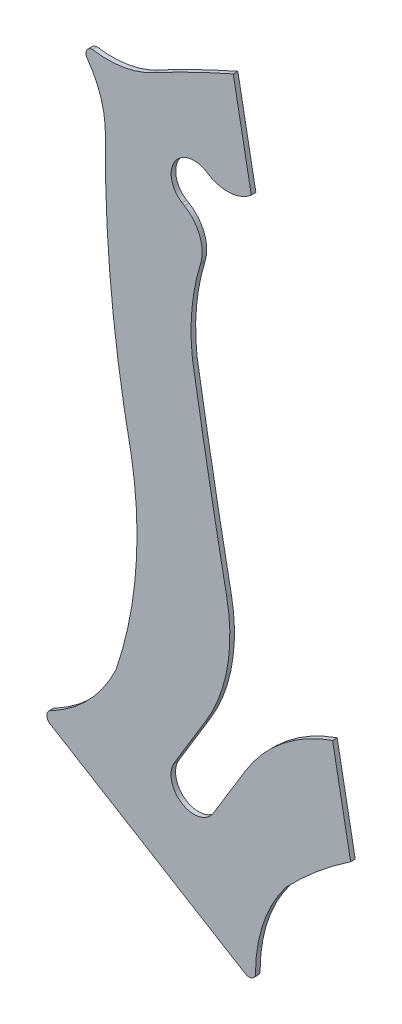
ISO-10303-21;
HEADER;
FILE_DESCRIPTION(('STEP AP214'),'2;1');
FILE_NAME('part.step','',(''),(''),'','','');
FILE_SCHEMA(('AUTOMOTIVE_DESIGN { 1 0 10303 214 1 1 1 1 }'));
ENDSEC;
DATA;
#1=APPLICATION_CONTEXT('core data for automotive mechanical design processes');
#2=APPLICATION_PROTOCOL_DEFINITION('international standard','automotive_design',2000,#1);
#3=PRODUCT_CONTEXT('',#1,'mechanical');
#4=PRODUCT('Part','Part','',(#3));
#5=PRODUCT_RELATED_PRODUCT_CATEGORY('part','',(#4));
#6=PRODUCT_DEFINITION_FORMATION('','',#4);
#7=PRODUCT_DEFINITION_CONTEXT('part definition',#1,'design');
#8=PRODUCT_DEFINITION('design','',#6,#7);
#9=PRODUCT_DEFINITION_SHAPE('','',#8);
#10=(LENGTH_UNIT() NAMED_UNIT(*) SI_UNIT(.MILLI.,.METRE.));
#11=(NAMED_UNIT(*) PLANE_ANGLE_UNIT() SI_UNIT($,.RADIAN.));
#12=(NAMED_UNIT(*) SI_UNIT($,.STERADIAN.) SOLID_ANGLE_UNIT());
#13=UNCERTAINTY_MEASURE_WITH_UNIT(LENGTH_MEASURE(1.E-05),#10,'distance_accuracy_value','');
#14=(GEOMETRIC_REPRESENTATION_CONTEXT(3) GLOBAL_UNCERTAINTY_ASSIGNED_CONTEXT((#13)) GLOBAL_UNIT_ASSIGNED_CONTEXT((#10,
#11,#12)) REPRESENTATION_CONTEXT('',''));
#15=CARTESIAN_POINT('',(0.,0.,0.));
#16=DIRECTION('',(0.,0.,1.));
#17=DIRECTION('',(1.,0.,0.));
#18=AXIS2_PLACEMENT_3D('',#15,#16,#17);
#19=CARTESIAN_POINT('',(-595.807272279208,616.910417452215,0.));
#20=DIRECTION('',(-0.982734564613668,-0.185021013708129,0.));
#21=DIRECTION('',(0.185021013708129,-0.982734564613668,0.));
#22=AXIS2_PLACEMENT_3D('',#19,#20,#21);
#23=PLANE('',#22);
#24=DIRECTION('',(0.185021013708129,-0.982734564613668,0.));
#25=VECTOR('',#24,1.);
#26=CARTESIAN_POINT('',(-168.673710483779,-1651.7989927399,0.));
#27=LINE('',#26,#25);
#28=CARTESIAN_POINT('',(-583.843519435553,553.365238413787,0.));
#29=VERTEX_POINT('',#28);
#30=CARTESIAN_POINT('',(-558.885959893304,420.803774615612,0.));
#31=VERTEX_POINT('',#30);
#32=EDGE_CURVE('E301',#29,#31,#27,.T.);
#33=ORIENTED_EDGE('',*,*,#32,.F.);
#34=DIRECTION('',(0.,0.,-1.));
#35=VECTOR('',#34,1.);
#36=CARTESIAN_POINT('',(-583.843519435553,553.365238413787,6.35));
#37=LINE('',#36,#35);
#38=CARTESIAN_POINT('',(-583.843519435553,553.365238413787,6.35));
#39=VERTEX_POINT('',#38);
#40=EDGE_CURVE('E302',#39,#29,#37,.T.);
#41=ORIENTED_EDGE('',*,*,#40,.F.);
#42=DIRECTION('',(0.185021013708129,-0.982734564613668,0.));
#43=VECTOR('',#42,1.);
#44=CARTESIAN_POINT('',(-168.673710483779,-1651.7989927399,6.35));
#45=LINE('',#44,#43);
#46=CARTESIAN_POINT('',(-558.885959893304,420.803774615612,6.35));
#47=VERTEX_POINT('',#46);
#48=EDGE_CURVE('E44',#39,#47,#45,.T.);
#49=ORIENTED_EDGE('',*,*,#48,.T.);
#50=DIRECTION('',(0.,0.,-1.));
#51=VECTOR('',#50,1.);
#52=CARTESIAN_POINT('',(-558.885959893304,420.803774615612,6.35));
#53=LINE('',#52,#51);
#54=EDGE_CURVE('E304',#31,#47,#53,.F.);
#55=ORIENTED_EDGE('',*,*,#54,.F.);
#56=EDGE_LOOP('',(#33,#41,#49,#55));
#57=FACE_BOUND('',#56,.T.);
#58=ADVANCED_FACE('F40',(#57),#23,.F.);
#59=CARTESIAN_POINT('',(-446.607072834725,-175.562773039793,6.35));
#60=VERTEX_POINT('',#59);
#61=CARTESIAN_POINT('',(-421.626142062902,-308.248372549149,6.35));
#62=VERTEX_POINT('',#61);
#63=EDGE_CURVE('E333',#60,#62,#45,.T.);
#64=ORIENTED_EDGE('',*,*,#63,.T.);
#65=DIRECTION('',(0.,0.,-1.));
#66=VECTOR('',#65,1.);
#67=CARTESIAN_POINT('',(-421.626142062902,-308.248372549149,6.35));
#68=LINE('',#67,#66);
#69=CARTESIAN_POINT('',(-421.626142062902,-308.248372549149,0.));
#70=VERTEX_POINT('',#69);
#71=EDGE_CURVE('E323',#62,#70,#68,.T.);
#72=ORIENTED_EDGE('',*,*,#71,.T.);
#73=CARTESIAN_POINT('',(-446.607072834725,-175.562773039793,0.));
#74=VERTEX_POINT('',#73);
#75=EDGE_CURVE('E296',#74,#70,#27,.T.);
#76=ORIENTED_EDGE('',*,*,#75,.F.);
#77=DIRECTION('',(0.,0.,-1.));
#78=VECTOR('',#77,1.);
#79=CARTESIAN_POINT('',(-446.607072834725,-175.562773039793,6.35));
#80=LINE('',#79,#78);
#81=EDGE_CURVE('E307',#60,#74,#80,.T.);
#82=ORIENTED_EDGE('',*,*,#81,.F.);
#83=EDGE_LOOP('',(#64,#72,#76,#82));
#84=FACE_BOUND('',#83,.T.);
#85=ADVANCED_FACE('F342',(#84),#23,.F.);
#86=CARTESIAN_POINT('',(-146.711440742145,-1647.66412096756,6.35));
#87=DIRECTION('',(0.,0.,1.));
#88=DIRECTION('',(1.,0.,0.));
#89=AXIS2_PLACEMENT_3D('',#86,#87,#88);
#90=PLANE('',#89);
#91=ORIENTED_EDGE('',*,*,#48,.F.);
#92=CARTESIAN_POINT('',(101.313713674877,-998.248317486922,6.35));
#93=DIRECTION('',(0.,0.,1.));
#94=DIRECTION('',(1.,0.,0.));
#95=AXIS2_PLACEMENT_3D('',#92,#93,#94);
#96=CIRCLE('',#95,1696.15596598261);
#97=CARTESIAN_POINT('',(-692.86211101161,500.494429091663,6.35));
#98=VERTEX_POINT('',#97);
#99=EDGE_CURVE('E139',#39,#98,#96,.T.);
#100=ORIENTED_EDGE('',*,*,#99,.T.);
#101=CARTESIAN_POINT('',(-757.496180180853,616.263088196707,6.35));
#102=DIRECTION('',(0.,0.,1.));
#103=DIRECTION('',(1.,0.,0.));
#104=AXIS2_PLACEMENT_3D('',#101,#102,#103);
#105=CIRCLE('',#104,132.589386182886);
#106=CARTESIAN_POINT('',(-778.634361676283,485.369533689922,6.35));
#107=VERTEX_POINT('',#106);
#108=EDGE_CURVE('E294',#107,#98,#105,.T.);
#109=ORIENTED_EDGE('',*,*,#108,.F.);
#110=CARTESIAN_POINT('',(-778.131598857839,476.167307801734,6.35));
#111=DIRECTION('',(0.,0.,1.));
#112=DIRECTION('',(1.,0.,0.));
#113=AXIS2_PLACEMENT_3D('',#110,#111,#112);
#114=CIRCLE('',#113,9.21594985602913);
#115=CARTESIAN_POINT('',(-786.532760791132,472.378612786392,6.35));
#116=VERTEX_POINT('',#115);
#117=EDGE_CURVE('E292',#107,#116,#114,.T.);
#118=ORIENTED_EDGE('',*,*,#117,.T.);
#119=CARTESIAN_POINT('',(-893.012468796338,393.372175634305,6.35));
#120=DIRECTION('',(0.,0.,1.));
#121=DIRECTION('',(1.,0.,0.));
#122=AXIS2_PLACEMENT_3D('',#119,#120,#121);
#123=CIRCLE('',#122,132.589386182834);
#124=CARTESIAN_POINT('',(-760.486593002621,389.268814396994,6.35));
#125=VERTEX_POINT('',#124);
#126=EDGE_CURVE('E216',#125,#116,#123,.T.);
#127=ORIENTED_EDGE('',*,*,#126,.F.);
#128=CARTESIAN_POINT('',(935.600172176311,373.947393991518,6.35));
#129=DIRECTION('',(0.,0.,1.));
#130=DIRECTION('',(1.,0.,0.));
#131=AXIS2_PLACEMENT_3D('',#128,#129,#130);
#132=CIRCLE('',#131,1696.1559659826);
#133=CARTESIAN_POINT('',(-724.729968779218,27.1781854781785,6.35));
#134=VERTEX_POINT('',#133);
#135=EDGE_CURVE('E288',#125,#134,#132,.T.);
#136=ORIENTED_EDGE('',*,*,#135,.T.);
#137=CARTESIAN_POINT('',(-1260.05593605962,-65.354714697655,6.35));
#138=DIRECTION('',(0.,0.,1.));
#139=DIRECTION('',(1.,0.,0.));
#140=AXIS2_PLACEMENT_3D('',#137,#138,#139);
#141=CIRCLE('',#140,543.264418915569);
#142=CARTESIAN_POINT('',(-745.623103348854,-239.983147344954,6.35));
#143=VERTEX_POINT('',#142);
#144=EDGE_CURVE('E285',#143,#134,#141,.T.);
#145=ORIENTED_EDGE('',*,*,#144,.F.);
#146=CARTESIAN_POINT('',(-929.332484300062,-155.12426119461,6.35));
#147=DIRECTION('',(0.,0.,1.));
#148=DIRECTION('',(1.,0.,0.));
#149=AXIS2_PLACEMENT_3D('',#146,#147,#148);
#150=CIRCLE('',#149,202.361476591157);
#151=CARTESIAN_POINT('',(-834.966129535259,-334.135876171256,6.35));
#152=VERTEX_POINT('',#151);
#153=EDGE_CURVE('E282',#152,#143,#150,.T.);
#154=ORIENTED_EDGE('',*,*,#153,.F.);
#155=CARTESIAN_POINT('',(-832.307098275944,-342.959893652528,6.35));
#156=DIRECTION('',(0.,0.,1.));
#157=DIRECTION('',(1.,0.,0.));
#158=AXIS2_PLACEMENT_3D('',#155,#156,#157);
#159=CIRCLE('',#158,9.21594985597405);
#160=CARTESIAN_POINT('',(-837.094869811113,-350.83459843905,6.35));
#161=VERTEX_POINT('',#160);
#162=EDGE_CURVE('E280',#152,#161,#159,.T.);
#163=ORIENTED_EDGE('',*,*,#162,.T.);
#164=DIRECTION('',(-0.854464803909369,0.519509286615863,0.));
#165=VECTOR('',#164,1.);
#166=CARTESIAN_POINT('',(242.626783769419,-1007.2986487182,6.35));
#167=LINE('',#166,#165);
#168=CARTESIAN_POINT('',(-566.864895068179,-515.132742445253,6.35));
#169=VERTEX_POINT('',#168);
#170=EDGE_CURVE('E277',#169,#161,#167,.T.);
#171=ORIENTED_EDGE('',*,*,#170,.F.);
#172=CARTESIAN_POINT('',(-562.077123533031,-507.258037658723,6.35));
#173=DIRECTION('',(0.,0.,1.));
#174=DIRECTION('',(1.,0.,0.));
#175=AXIS2_PLACEMENT_3D('',#172,#173,#174);
#176=CIRCLE('',#175,9.21594985597236);
#177=CARTESIAN_POINT('',(-553.019378541291,-505.55774726811,6.35));
#178=VERTEX_POINT('',#177);
#179=EDGE_CURVE('E274',#169,#178,#176,.T.);
#180=ORIENTED_EDGE('',*,*,#179,.T.);
#181=CARTESIAN_POINT('',(-350.662704377986,-506.951888474319,6.35));
#182=DIRECTION('',(0.,0.,1.));
#183=DIRECTION('',(1.,0.,0.));
#184=AXIS2_PLACEMENT_3D('',#181,#182,#183);
#185=CIRCLE('',#184,202.361476591148);
#186=CARTESIAN_POINT('',(-510.547599401306,-382.907591743143,6.35));
#187=VERTEX_POINT('',#186);
#188=EDGE_CURVE('E271',#187,#178,#185,.T.);
#189=ORIENTED_EDGE('',*,*,#188,.F.);
#190=CARTESIAN_POINT('',(-118.759256121082,-759.25599804977,6.35));
#191=DIRECTION('',(0.,0.,1.));
#192=DIRECTION('',(1.,0.,0.));
#193=AXIS2_PLACEMENT_3D('',#190,#191,#192);
#194=CIRCLE('',#193,543.264418915691);
#195=EDGE_CURVE('E275',#62,#187,#194,.T.);
#196=ORIENTED_EDGE('',*,*,#195,.F.);
#197=ORIENTED_EDGE('',*,*,#63,.F.);
#198=CARTESIAN_POINT('',(-372.193427367632,-391.712187492445,6.35));
#199=DIRECTION('',(0.,0.,1.));
#200=DIRECTION('',(1.,0.,0.));
#201=AXIS2_PLACEMENT_3D('',#198,#199,#200);
#202=CIRCLE('',#201,228.599999999839);
#203=CARTESIAN_POINT('',(-567.524081541108,-272.952364571719,6.35));
#204=VERTEX_POINT('',#203);
#205=EDGE_CURVE('E270',#60,#204,#202,.T.);
#206=ORIENTED_EDGE('',*,*,#205,.T.);
#207=DIRECTION('',(0.519509286616884,0.854464803908749,0.));
#208=VECTOR('',#207,1.);
#209=CARTESIAN_POINT('',(-1064.18884942714,-1089.84356254003,6.35));
#210=LINE('',#209,#208);
#211=CARTESIAN_POINT('',(-611.01367111314,-344.482026471955,6.35));
#212=VERTEX_POINT('',#211);
#213=EDGE_CURVE('E267',#212,#204,#210,.T.);
#214=ORIENTED_EDGE('',*,*,#213,.F.);
#215=CARTESIAN_POINT('',(-638.142928637472,-327.987606621774,6.35));
#216=DIRECTION('',(0.,0.,1.));
#217=DIRECTION('',(1.,0.,0.));
#218=AXIS2_PLACEMENT_3D('',#215,#216,#217);
#219=CIRCLE('',#218,31.7500000002435);
#220=CARTESIAN_POINT('',(-665.272186161801,-311.493186771594,6.35));
#221=VERTEX_POINT('',#220);
#222=EDGE_CURVE('E264',#221,#212,#219,.T.);
#223=ORIENTED_EDGE('',*,*,#222,.F.);
#224=DIRECTION('',(0.519509286616441,0.854464803909018,0.));
#225=VECTOR('',#224,1.);
#226=CARTESIAN_POINT('',(-1118.44736447569,-1056.85472284034,6.35));
#227=LINE('',#226,#225);
#228=CARTESIAN_POINT('',(-621.782596590261,-239.963524872085,6.35));
#229=VERTEX_POINT('',#228);
#230=EDGE_CURVE('E261',#221,#229,#227,.T.);
#231=ORIENTED_EDGE('',*,*,#230,.T.);
#232=CARTESIAN_POINT('',(-817.113250763849,-121.203701951544,6.35));
#233=DIRECTION('',(0.,0.,1.));
#234=DIRECTION('',(1.,0.,0.));
#235=AXIS2_PLACEMENT_3D('',#232,#233,#234);
#236=CIRCLE('',#235,228.599999999843);
#237=CARTESIAN_POINT('',(-592.845089449618,-76.9120343305014,6.35));
#238=VERTEX_POINT('',#237);
#239=EDGE_CURVE('E259',#229,#238,#236,.T.);
#240=ORIENTED_EDGE('',*,*,#239,.T.);
#241=CARTESIAN_POINT('',(7879.01936580354,1596.23230427157,6.35));
#242=DIRECTION('',(0.,0.,1.));
#243=DIRECTION('',(1.,0.,0.));
#244=AXIS2_PLACEMENT_3D('',#241,#242,#243);
#245=CIRCLE('',#244,8635.50226251942);
#246=CARTESIAN_POINT('',(-640.198587445303,183.849639757226,6.35));
#247=VERTEX_POINT('',#246);
#248=EDGE_CURVE('E256',#247,#238,#245,.T.);
#249=ORIENTED_EDGE('',*,*,#248,.F.);
#250=CARTESIAN_POINT('',(-353.119452704755,217.37129382989,6.35));
#251=DIRECTION('',(0.,0.,1.));
#252=DIRECTION('',(1.,0.,0.));
#253=AXIS2_PLACEMENT_3D('',#250,#251,#252);
#254=CIRCLE('',#253,289.029636707155);
#255=CARTESIAN_POINT('',(-629.075505090477,303.31539221226,6.35));
#256=VERTEX_POINT('',#255);
#257=EDGE_CURVE('E253',#256,#247,#254,.T.);
#258=ORIENTED_EDGE('',*,*,#257,.F.);
#259=CARTESIAN_POINT('',(-677.577685073191,318.420971858689,6.35));
#260=DIRECTION('',(0.,0.,1.));
#261=DIRECTION('',(1.,0.,0.));
#262=AXIS2_PLACEMENT_3D('',#259,#260,#261);
#263=CIRCLE('',#262,50.7999999953769);
#264=CARTESIAN_POINT('',(-651.186613315133,361.827783893108,6.35));
#265=VERTEX_POINT('',#264);
#266=EDGE_CURVE('E249',#256,#265,#263,.T.);
#267=ORIENTED_EDGE('',*,*,#266,.T.);
#268=DIRECTION('',(-0.854464803906054,0.519509286621317,0.));
#269=VECTOR('',#268,1.);
#270=CARTESIAN_POINT('',(609.154086737313,-404.451523330465,6.35));
#271=LINE('',#270,#269);
#272=CARTESIAN_POINT('',(-654.429109389422,363.799201340294,6.35));
#273=VERTEX_POINT('',#272);
#274=EDGE_CURVE('E246',#265,#273,#271,.T.);
#275=ORIENTED_EDGE('',*,*,#274,.T.);
#276=CARTESIAN_POINT('',(-637.934689539119,390.928458864549,6.35));
#277=DIRECTION('',(0.,0.,1.));
#278=DIRECTION('',(1.,0.,0.));
#279=AXIS2_PLACEMENT_3D('',#276,#277,#278);
#280=CIRCLE('',#279,31.7500000002435);
#281=CARTESIAN_POINT('',(-621.440269688581,418.057716388663,6.35));
#282=VERTEX_POINT('',#281);
#283=EDGE_CURVE('E241',#282,#273,#280,.T.);
#284=ORIENTED_EDGE('',*,*,#283,.F.);
#285=DIRECTION('',(-0.854464803904012,0.519509286624676,0.));
#286=VECTOR('',#285,1.);
#287=CARTESIAN_POINT('',(642.142926440099,-350.193008290082,6.35));
#288=LINE('',#287,#286);
#289=CARTESIAN_POINT('',(-618.197773615554,416.086298942227,6.35));
#290=VERTEX_POINT('',#289);
#291=EDGE_CURVE('E238',#290,#282,#288,.T.);
#292=ORIENTED_EDGE('',*,*,#291,.F.);
#293=CARTESIAN_POINT('',(-591.806701857498,459.493110976643,6.35));
#294=DIRECTION('',(0.,0.,1.));
#295=DIRECTION('',(1.,0.,0.));
#296=AXIS2_PLACEMENT_3D('',#293,#294,#295);
#297=CIRCLE('',#296,50.7999999953742);
#298=EDGE_CURVE('E242',#290,#47,#297,.T.);
#299=ORIENTED_EDGE('',*,*,#298,.T.);
#300=EDGE_LOOP('',(#91,#100,#109,#118,#127,#136,#145,#154,#163,#171,#180,#189,#196,#197,#206,
#214,#223,#231,#240,#249,#258,#267,#275,#284,#292,#299));
#301=FACE_BOUND('',#300,.T.);
#302=ADVANCED_FACE('F42',(#301),#90,.T.);
#303=CARTESIAN_POINT('',(-146.711440742145,-1647.66412096756,0.));
#304=DIRECTION('',(0.,0.,1.));
#305=DIRECTION('',(1.,0.,0.));
#306=AXIS2_PLACEMENT_3D('',#303,#304,#305);
#307=PLANE('',#306);
#308=CARTESIAN_POINT('',(101.313713674877,-998.248317486922,0.));
#309=DIRECTION('',(0.,0.,1.));
#310=DIRECTION('',(1.,0.,0.));
#311=AXIS2_PLACEMENT_3D('',#308,#309,#310);
#312=CIRCLE('',#311,1696.15596598261);
#313=CARTESIAN_POINT('',(-692.86211101161,500.494429091663,0.));
#314=VERTEX_POINT('',#313);
#315=EDGE_CURVE('E11',#29,#314,#312,.T.);
#316=ORIENTED_EDGE('',*,*,#315,.F.);
#317=ORIENTED_EDGE('',*,*,#32,.T.);
#318=CARTESIAN_POINT('',(-591.806701857498,459.493110976643,0.));
#319=DIRECTION('',(0.,0.,1.));
#320=DIRECTION('',(1.,0.,0.));
#321=AXIS2_PLACEMENT_3D('',#318,#319,#320);
#322=CIRCLE('',#321,50.7999999953742);
#323=CARTESIAN_POINT('',(-618.197773615554,416.086298942227,0.));
#324=VERTEX_POINT('',#323);
#325=EDGE_CURVE('E312',#324,#31,#322,.T.);
#326=ORIENTED_EDGE('',*,*,#325,.F.);
#327=DIRECTION('',(-0.854464803904012,0.519509286624676,0.));
#328=VECTOR('',#327,1.);
#329=CARTESIAN_POINT('',(642.142926440099,-350.193008290082,0.));
#330=LINE('',#329,#328);
#331=CARTESIAN_POINT('',(-621.440269688581,418.057716388663,0.));
#332=VERTEX_POINT('',#331);
#333=EDGE_CURVE('E314',#324,#332,#330,.T.);
#334=ORIENTED_EDGE('',*,*,#333,.T.);
#335=CARTESIAN_POINT('',(-637.934689539119,390.928458864549,0.));
#336=DIRECTION('',(0.,0.,1.));
#337=DIRECTION('',(1.,0.,0.));
#338=AXIS2_PLACEMENT_3D('',#335,#336,#337);
#339=CIRCLE('',#338,31.7500000002435);
#340=CARTESIAN_POINT('',(-654.429109389422,363.799201340294,0.));
#341=VERTEX_POINT('',#340);
#342=EDGE_CURVE('E390',#332,#341,#339,.T.);
#343=ORIENTED_EDGE('',*,*,#342,.T.);
#344=DIRECTION('',(-0.854464803906054,0.519509286621317,0.));
#345=VECTOR('',#344,1.);
#346=CARTESIAN_POINT('',(609.154086737313,-404.451523330465,0.));
#347=LINE('',#346,#345);
#348=CARTESIAN_POINT('',(-651.186613315133,361.827783893108,0.));
#349=VERTEX_POINT('',#348);
#350=EDGE_CURVE('E394',#349,#341,#347,.T.);
#351=ORIENTED_EDGE('',*,*,#350,.F.);
#352=CARTESIAN_POINT('',(-677.577685073191,318.420971858689,0.));
#353=DIRECTION('',(0.,0.,1.));
#354=DIRECTION('',(1.,0.,0.));
#355=AXIS2_PLACEMENT_3D('',#352,#353,#354);
#356=CIRCLE('',#355,50.7999999953769);
#357=CARTESIAN_POINT('',(-629.075505090477,303.31539221226,0.));
#358=VERTEX_POINT('',#357);
#359=EDGE_CURVE('E398',#358,#349,#356,.T.);
#360=ORIENTED_EDGE('',*,*,#359,.F.);
#361=CARTESIAN_POINT('',(-353.119452704755,217.37129382989,0.));
#362=DIRECTION('',(0.,0.,1.));
#363=DIRECTION('',(1.,0.,0.));
#364=AXIS2_PLACEMENT_3D('',#361,#362,#363);
#365=CIRCLE('',#364,289.029636707155);
#366=CARTESIAN_POINT('',(-640.198587445303,183.849639757226,0.));
#367=VERTEX_POINT('',#366);
#368=EDGE_CURVE('E402',#358,#367,#365,.T.);
#369=ORIENTED_EDGE('',*,*,#368,.T.);
#370=CARTESIAN_POINT('',(7879.01936580354,1596.23230427157,0.));
#371=DIRECTION('',(0.,0.,1.));
#372=DIRECTION('',(1.,0.,0.));
#373=AXIS2_PLACEMENT_3D('',#370,#371,#372);
#374=CIRCLE('',#373,8635.50226251942);
#375=CARTESIAN_POINT('',(-592.845089449618,-76.9120343305014,0.));
#376=VERTEX_POINT('',#375);
#377=EDGE_CURVE('E405',#367,#376,#374,.T.);
#378=ORIENTED_EDGE('',*,*,#377,.T.);
#379=CARTESIAN_POINT('',(-817.113250763849,-121.203701951544,0.));
#380=DIRECTION('',(0.,0.,1.));
#381=DIRECTION('',(1.,0.,0.));
#382=AXIS2_PLACEMENT_3D('',#379,#380,#381);
#383=CIRCLE('',#382,228.599999999843);
#384=CARTESIAN_POINT('',(-621.782596590261,-239.963524872085,0.));
#385=VERTEX_POINT('',#384);
#386=EDGE_CURVE('E408',#385,#376,#383,.T.);
#387=ORIENTED_EDGE('',*,*,#386,.F.);
#388=DIRECTION('',(0.519509286616441,0.854464803909018,0.));
#389=VECTOR('',#388,1.);
#390=CARTESIAN_POINT('',(-1118.44736447569,-1056.85472284034,0.));
#391=LINE('',#390,#389);
#392=CARTESIAN_POINT('',(-665.272186161801,-311.493186771594,0.));
#393=VERTEX_POINT('',#392);
#394=EDGE_CURVE('E411',#393,#385,#391,.T.);
#395=ORIENTED_EDGE('',*,*,#394,.F.);
#396=CARTESIAN_POINT('',(-638.142928637472,-327.987606621774,0.));
#397=DIRECTION('',(0.,0.,1.));
#398=DIRECTION('',(1.,0.,0.));
#399=AXIS2_PLACEMENT_3D('',#396,#397,#398);
#400=CIRCLE('',#399,31.7500000002435);
#401=CARTESIAN_POINT('',(-611.01367111314,-344.482026471955,0.));
#402=VERTEX_POINT('',#401);
#403=EDGE_CURVE('E414',#393,#402,#400,.T.);
#404=ORIENTED_EDGE('',*,*,#403,.T.);
#405=DIRECTION('',(0.519509286616884,0.854464803908749,0.));
#406=VECTOR('',#405,1.);
#407=CARTESIAN_POINT('',(-1064.18884942714,-1089.84356254003,0.));
#408=LINE('',#407,#406);
#409=CARTESIAN_POINT('',(-567.524081541108,-272.952364571719,0.));
#410=VERTEX_POINT('',#409);
#411=EDGE_CURVE('E321',#402,#410,#408,.T.);
#412=ORIENTED_EDGE('',*,*,#411,.T.);
#413=CARTESIAN_POINT('',(-372.193427367632,-391.712187492445,0.));
#414=DIRECTION('',(0.,0.,1.));
#415=DIRECTION('',(1.,0.,0.));
#416=AXIS2_PLACEMENT_3D('',#413,#414,#415);
#417=CIRCLE('',#416,228.599999999839);
#418=EDGE_CURVE('E319',#74,#410,#417,.T.);
#419=ORIENTED_EDGE('',*,*,#418,.F.);
#420=ORIENTED_EDGE('',*,*,#75,.T.);
#421=CARTESIAN_POINT('',(-118.759256121082,-759.25599804977,0.));
#422=DIRECTION('',(0.,0.,1.));
#423=DIRECTION('',(1.,0.,0.));
#424=AXIS2_PLACEMENT_3D('',#421,#422,#423);
#425=CIRCLE('',#424,543.264418915691);
#426=CARTESIAN_POINT('',(-510.547599401306,-382.907591743143,0.));
#427=VERTEX_POINT('',#426);
#428=EDGE_CURVE('E316',#70,#427,#425,.T.);
#429=ORIENTED_EDGE('',*,*,#428,.T.);
#430=CARTESIAN_POINT('',(-350.662704377986,-506.951888474319,0.));
#431=DIRECTION('',(0.,0.,1.));
#432=DIRECTION('',(1.,0.,0.));
#433=AXIS2_PLACEMENT_3D('',#430,#431,#432);
#434=CIRCLE('',#433,202.361476591148);
#435=CARTESIAN_POINT('',(-553.019378541291,-505.55774726811,0.));
#436=VERTEX_POINT('',#435);
#437=EDGE_CURVE('E318',#427,#436,#434,.T.);
#438=ORIENTED_EDGE('',*,*,#437,.T.);
#439=CARTESIAN_POINT('',(-562.077123533031,-507.258037658723,0.));
#440=DIRECTION('',(0.,0.,1.));
#441=DIRECTION('',(1.,0.,0.));
#442=AXIS2_PLACEMENT_3D('',#439,#440,#441);
#443=CIRCLE('',#442,9.21594985597236);
#444=CARTESIAN_POINT('',(-566.864895068179,-515.132742445253,0.));
#445=VERTEX_POINT('',#444);
#446=EDGE_CURVE('E420',#445,#436,#443,.T.);
#447=ORIENTED_EDGE('',*,*,#446,.F.);
#448=DIRECTION('',(-0.854464803909369,0.519509286615863,0.));
#449=VECTOR('',#448,1.);
#450=CARTESIAN_POINT('',(242.626783769419,-1007.2986487182,0.));
#451=LINE('',#450,#449);
#452=CARTESIAN_POINT('',(-837.094869811113,-350.83459843905,0.));
#453=VERTEX_POINT('',#452);
#454=EDGE_CURVE('E423',#445,#453,#451,.T.);
#455=ORIENTED_EDGE('',*,*,#454,.T.);
#456=CARTESIAN_POINT('',(-832.307098275944,-342.959893652528,0.));
#457=DIRECTION('',(0.,0.,1.));
#458=DIRECTION('',(1.,0.,0.));
#459=AXIS2_PLACEMENT_3D('',#456,#457,#458);
#460=CIRCLE('',#459,9.21594985597405);
#461=CARTESIAN_POINT('',(-834.966129535259,-334.135876171256,0.));
#462=VERTEX_POINT('',#461);
#463=EDGE_CURVE('E426',#462,#453,#460,.T.);
#464=ORIENTED_EDGE('',*,*,#463,.F.);
#465=CARTESIAN_POINT('',(-929.332484300062,-155.12426119461,0.));
#466=DIRECTION('',(0.,0.,1.));
#467=DIRECTION('',(1.,0.,0.));
#468=AXIS2_PLACEMENT_3D('',#465,#466,#467);
#469=CIRCLE('',#468,202.361476591157);
#470=CARTESIAN_POINT('',(-745.623103348854,-239.983147344954,0.));
#471=VERTEX_POINT('',#470);
#472=EDGE_CURVE('E429',#462,#471,#469,.T.);
#473=ORIENTED_EDGE('',*,*,#472,.T.);
#474=CARTESIAN_POINT('',(-1260.05593605962,-65.354714697655,0.));
#475=DIRECTION('',(0.,0.,1.));
#476=DIRECTION('',(1.,0.,0.));
#477=AXIS2_PLACEMENT_3D('',#474,#475,#476);
#478=CIRCLE('',#477,543.264418915569);
#479=CARTESIAN_POINT('',(-724.729968779218,27.1781854781785,0.));
#480=VERTEX_POINT('',#479);
#481=EDGE_CURVE('E233',#471,#480,#478,.T.);
#482=ORIENTED_EDGE('',*,*,#481,.T.);
#483=CARTESIAN_POINT('',(935.600172176311,373.947393991518,0.));
#484=DIRECTION('',(0.,0.,1.));
#485=DIRECTION('',(1.,0.,0.));
#486=AXIS2_PLACEMENT_3D('',#483,#484,#485);
#487=CIRCLE('',#486,1696.1559659826);
#488=CARTESIAN_POINT('',(-760.486593002621,389.268814396994,0.));
#489=VERTEX_POINT('',#488);
#490=EDGE_CURVE('E230',#489,#480,#487,.T.);
#491=ORIENTED_EDGE('',*,*,#490,.F.);
#492=CARTESIAN_POINT('',(-893.012468796338,393.372175634305,0.));
#493=DIRECTION('',(0.,0.,1.));
#494=DIRECTION('',(1.,0.,0.));
#495=AXIS2_PLACEMENT_3D('',#492,#493,#494);
#496=CIRCLE('',#495,132.589386182834);
#497=CARTESIAN_POINT('',(-786.532760791132,472.378612786392,0.));
#498=VERTEX_POINT('',#497);
#499=EDGE_CURVE('E214',#489,#498,#496,.T.);
#500=ORIENTED_EDGE('',*,*,#499,.T.);
#501=CARTESIAN_POINT('',(-778.131598857839,476.167307801734,0.));
#502=DIRECTION('',(0.,0.,1.));
#503=DIRECTION('',(1.,0.,0.));
#504=AXIS2_PLACEMENT_3D('',#501,#502,#503);
#505=CIRCLE('',#504,9.21594985602913);
#506=CARTESIAN_POINT('',(-778.634361676283,485.369533689922,0.));
#507=VERTEX_POINT('',#506);
#508=EDGE_CURVE('E221',#507,#498,#505,.T.);
#509=ORIENTED_EDGE('',*,*,#508,.F.);
#510=CARTESIAN_POINT('',(-757.496180180853,616.263088196707,0.));
#511=DIRECTION('',(0.,0.,1.));
#512=DIRECTION('',(1.,0.,0.));
#513=AXIS2_PLACEMENT_3D('',#510,#511,#512);
#514=CIRCLE('',#513,132.589386182886);
#515=EDGE_CURVE('E50',#507,#314,#514,.T.);
#516=ORIENTED_EDGE('',*,*,#515,.T.);
#517=EDGE_LOOP('',(#316,#317,#326,#334,#343,#351,#360,#369,#378,#387,#395,#404,#412,#419,#420,
#429,#438,#447,#455,#464,#473,#482,#491,#500,#509,#516));
#518=FACE_BOUND('',#517,.T.);
#519=ADVANCED_FACE('F227',(#518),#307,.F.);
#520=CARTESIAN_POINT('',(-372.193427367632,-391.712187492445,6.35));
#521=DIRECTION('',(0.,0.,-1.));
#522=DIRECTION('',(-1.,0.,0.));
#523=AXIS2_PLACEMENT_3D('',#520,#521,#522);
#524=CYLINDRICAL_SURFACE('',#523,228.599999999839);
#525=ORIENTED_EDGE('',*,*,#205,.F.);
#526=ORIENTED_EDGE('',*,*,#81,.T.);
#527=ORIENTED_EDGE('',*,*,#418,.T.);
#528=DIRECTION('',(0.,0.,-1.));
#529=VECTOR('',#528,1.);
#530=CARTESIAN_POINT('',(-567.524081541108,-272.952364571719,6.35));
#531=LINE('',#530,#529);
#532=EDGE_CURVE('E300',#204,#410,#531,.T.);
#533=ORIENTED_EDGE('',*,*,#532,.F.);
#534=EDGE_LOOP('',(#525,#526,#527,#533));
#535=FACE_BOUND('',#534,.T.);
#536=ADVANCED_FACE('F535',(#535),#524,.T.);
#537=CARTESIAN_POINT('',(-1064.18884942714,-1089.84356254003,6.35));
#538=DIRECTION('',(-0.854464803908749,0.519509286616884,0.));
#539=DIRECTION('',(-0.519509286616884,-0.854464803908749,0.));
#540=AXIS2_PLACEMENT_3D('',#537,#538,#539);
#541=PLANE('',#540);
#542=ORIENTED_EDGE('',*,*,#411,.F.);
#543=DIRECTION('',(0.,0.,-1.));
#544=VECTOR('',#543,1.);
#545=CARTESIAN_POINT('',(-611.01367111314,-344.482026471955,6.35));
#546=LINE('',#545,#544);
#547=EDGE_CURVE('E364',#212,#402,#546,.T.);
#548=ORIENTED_EDGE('',*,*,#547,.F.);
#549=ORIENTED_EDGE('',*,*,#213,.T.);
#550=ORIENTED_EDGE('',*,*,#532,.T.);
#551=EDGE_LOOP('',(#542,#548,#549,#550));
#552=FACE_BOUND('',#551,.T.);
#553=ADVANCED_FACE('F531',(#552),#541,.T.);
#554=CARTESIAN_POINT('',(-638.142928637472,-327.987606621774,6.35));
#555=DIRECTION('',(0.,0.,-1.));
#556=DIRECTION('',(-1.,0.,0.));
#557=AXIS2_PLACEMENT_3D('',#554,#555,#556);
#558=CYLINDRICAL_SURFACE('',#557,31.7500000002435);
#559=ORIENTED_EDGE('',*,*,#403,.F.);
#560=DIRECTION('',(0.,0.,-1.));
#561=VECTOR('',#560,1.);
#562=CARTESIAN_POINT('',(-665.272186161801,-311.493186771594,6.35));
#563=LINE('',#562,#561);
#564=EDGE_CURVE('E366',#221,#393,#563,.T.);
#565=ORIENTED_EDGE('',*,*,#564,.F.);
#566=ORIENTED_EDGE('',*,*,#222,.T.);
#567=ORIENTED_EDGE('',*,*,#547,.T.);
#568=EDGE_LOOP('',(#559,#565,#566,#567));
#569=FACE_BOUND('',#568,.T.);
#570=ADVANCED_FACE('F527',(#569),#558,.F.);
#571=CARTESIAN_POINT('',(-1118.44736447569,-1056.85472284034,6.35));
#572=DIRECTION('',(-0.854464803909018,0.519509286616441,0.));
#573=DIRECTION('',(-0.519509286616441,-0.854464803909018,0.));
#574=AXIS2_PLACEMENT_3D('',#571,#572,#573);
#575=PLANE('',#574);
#576=ORIENTED_EDGE('',*,*,#394,.T.);
#577=DIRECTION('',(0.,0.,-1.));
#578=VECTOR('',#577,1.);
#579=CARTESIAN_POINT('',(-621.782596590261,-239.963524872085,6.35));
#580=LINE('',#579,#578);
#581=EDGE_CURVE('E368',#229,#385,#580,.T.);
#582=ORIENTED_EDGE('',*,*,#581,.F.);
#583=ORIENTED_EDGE('',*,*,#230,.F.);
#584=ORIENTED_EDGE('',*,*,#564,.T.);
#585=EDGE_LOOP('',(#576,#582,#583,#584));
#586=FACE_BOUND('',#585,.T.);
#587=ADVANCED_FACE('F523',(#586),#575,.F.);
#588=CARTESIAN_POINT('',(-817.113250763849,-121.203701951544,6.35));
#589=DIRECTION('',(0.,0.,-1.));
#590=DIRECTION('',(-1.,0.,0.));
#591=AXIS2_PLACEMENT_3D('',#588,#589,#590);
#592=CYLINDRICAL_SURFACE('',#591,228.599999999843);
#593=ORIENTED_EDGE('',*,*,#386,.T.);
#594=DIRECTION('',(0.,0.,-1.));
#595=VECTOR('',#594,1.);
#596=CARTESIAN_POINT('',(-592.845089449618,-76.9120343305014,6.35));
#597=LINE('',#596,#595);
#598=EDGE_CURVE('E371',#238,#376,#597,.T.);
#599=ORIENTED_EDGE('',*,*,#598,.F.);
#600=ORIENTED_EDGE('',*,*,#239,.F.);
#601=ORIENTED_EDGE('',*,*,#581,.T.);
#602=EDGE_LOOP('',(#593,#599,#600,#601));
#603=FACE_BOUND('',#602,.T.);
#604=ADVANCED_FACE('F519',(#603),#592,.T.);
#605=CARTESIAN_POINT('',(7879.01936580354,1596.23230427157,6.35));
#606=DIRECTION('',(0.,0.,-1.));
#607=DIRECTION('',(-1.,0.,0.));
#608=AXIS2_PLACEMENT_3D('',#605,#606,#607);
#609=CYLINDRICAL_SURFACE('',#608,8635.50226251942);
#610=ORIENTED_EDGE('',*,*,#377,.F.);
#611=DIRECTION('',(0.,0.,-1.));
#612=VECTOR('',#611,1.);
#613=CARTESIAN_POINT('',(-640.198587445303,183.849639757226,6.35));
#614=LINE('',#613,#612);
#615=EDGE_CURVE('E373',#247,#367,#614,.T.);
#616=ORIENTED_EDGE('',*,*,#615,.F.);
#617=ORIENTED_EDGE('',*,*,#248,.T.);
#618=ORIENTED_EDGE('',*,*,#598,.T.);
#619=EDGE_LOOP('',(#610,#616,#617,#618));
#620=FACE_BOUND('',#619,.T.);
#621=ADVANCED_FACE('F515',(#620),#609,.F.);
#622=CARTESIAN_POINT('',(-353.119452704755,217.37129382989,6.35));
#623=DIRECTION('',(0.,0.,-1.));
#624=DIRECTION('',(-1.,0.,0.));
#625=AXIS2_PLACEMENT_3D('',#622,#623,#624);
#626=CYLINDRICAL_SURFACE('',#625,289.029636707155);
#627=ORIENTED_EDGE('',*,*,#368,.F.);
#628=DIRECTION('',(0.,0.,-1.));
#629=VECTOR('',#628,1.);
#630=CARTESIAN_POINT('',(-629.075505090477,303.31539221226,6.35));
#631=LINE('',#630,#629);
#632=EDGE_CURVE('E375',#256,#358,#631,.T.);
#633=ORIENTED_EDGE('',*,*,#632,.F.);
#634=ORIENTED_EDGE('',*,*,#257,.T.);
#635=ORIENTED_EDGE('',*,*,#615,.T.);
#636=EDGE_LOOP('',(#627,#633,#634,#635));
#637=FACE_BOUND('',#636,.T.);
#638=ADVANCED_FACE('F511',(#637),#626,.F.);
#639=CARTESIAN_POINT('',(-677.577685073191,318.420971858689,6.35));
#640=DIRECTION('',(0.,0.,-1.));
#641=DIRECTION('',(-1.,0.,0.));
#642=AXIS2_PLACEMENT_3D('',#639,#640,#641);
#643=CYLINDRICAL_SURFACE('',#642,50.7999999953769);
#644=ORIENTED_EDGE('',*,*,#359,.T.);
#645=DIRECTION('',(0.,0.,-1.));
#646=VECTOR('',#645,1.);
#647=CARTESIAN_POINT('',(-651.186613315133,361.827783893108,6.35));
#648=LINE('',#647,#646);
#649=EDGE_CURVE('E377',#265,#349,#648,.T.);
#650=ORIENTED_EDGE('',*,*,#649,.F.);
#651=ORIENTED_EDGE('',*,*,#266,.F.);
#652=ORIENTED_EDGE('',*,*,#632,.T.);
#653=EDGE_LOOP('',(#644,#650,#651,#652));
#654=FACE_BOUND('',#653,.T.);
#655=ADVANCED_FACE('F507',(#654),#643,.T.);
#656=CARTESIAN_POINT('',(609.154086737313,-404.451523330465,6.35));
#657=DIRECTION('',(-0.519509286621317,-0.854464803906054,0.));
#658=DIRECTION('',(0.854464803906054,-0.519509286621317,0.));
#659=AXIS2_PLACEMENT_3D('',#656,#657,#658);
#660=PLANE('',#659);
#661=ORIENTED_EDGE('',*,*,#350,.T.);
#662=DIRECTION('',(0.,0.,-1.));
#663=VECTOR('',#662,1.);
#664=CARTESIAN_POINT('',(-654.429109389422,363.799201340294,6.35));
#665=LINE('',#664,#663);
#666=EDGE_CURVE('E381',#273,#341,#665,.T.);
#667=ORIENTED_EDGE('',*,*,#666,.F.);
#668=ORIENTED_EDGE('',*,*,#274,.F.);
#669=ORIENTED_EDGE('',*,*,#649,.T.);
#670=EDGE_LOOP('',(#661,#667,#668,#669));
#671=FACE_BOUND('',#670,.T.);
#672=ADVANCED_FACE('F503',(#671),#660,.F.);
#673=CARTESIAN_POINT('',(-637.934689539119,390.928458864549,6.35));
#674=DIRECTION('',(0.,0.,-1.));
#675=DIRECTION('',(-1.,0.,0.));
#676=AXIS2_PLACEMENT_3D('',#673,#674,#675);
#677=CYLINDRICAL_SURFACE('',#676,31.7500000002435);
#678=ORIENTED_EDGE('',*,*,#342,.F.);
#679=DIRECTION('',(0.,0.,-1.));
#680=VECTOR('',#679,1.);
#681=CARTESIAN_POINT('',(-621.440269688581,418.057716388663,6.35));
#682=LINE('',#681,#680);
#683=EDGE_CURVE('E384',#282,#332,#682,.T.);
#684=ORIENTED_EDGE('',*,*,#683,.F.);
#685=ORIENTED_EDGE('',*,*,#283,.T.);
#686=ORIENTED_EDGE('',*,*,#666,.T.);
#687=EDGE_LOOP('',(#678,#684,#685,#686));
#688=FACE_BOUND('',#687,.T.);
#689=ADVANCED_FACE('F499',(#688),#677,.F.);
#690=CARTESIAN_POINT('',(642.142926440099,-350.193008290082,6.35));
#691=DIRECTION('',(-0.519509286624676,-0.854464803904011,0.));
#692=DIRECTION('',(0.854464803904012,-0.519509286624676,0.));
#693=AXIS2_PLACEMENT_3D('',#690,#691,#692);
#694=PLANE('',#693);
#695=ORIENTED_EDGE('',*,*,#333,.F.);
#696=DIRECTION('',(0.,0.,-1.));
#697=VECTOR('',#696,1.);
#698=CARTESIAN_POINT('',(-618.197773615554,416.086298942227,6.35));
#699=LINE('',#698,#697);
#700=EDGE_CURVE('E146',#290,#324,#699,.T.);
#701=ORIENTED_EDGE('',*,*,#700,.F.);
#702=ORIENTED_EDGE('',*,*,#291,.T.);
#703=ORIENTED_EDGE('',*,*,#683,.T.);
#704=EDGE_LOOP('',(#695,#701,#702,#703));
#705=FACE_BOUND('',#704,.T.);
#706=ADVANCED_FACE('F489',(#705),#694,.T.);
#707=CARTESIAN_POINT('',(-591.806701857498,459.493110976643,6.35));
#708=DIRECTION('',(0.,0.,-1.));
#709=DIRECTION('',(-1.,0.,0.));
#710=AXIS2_PLACEMENT_3D('',#707,#708,#709);
#711=CYLINDRICAL_SURFACE('',#710,50.7999999953742);
#712=ORIENTED_EDGE('',*,*,#325,.T.);
#713=ORIENTED_EDGE('',*,*,#54,.T.);
#714=ORIENTED_EDGE('',*,*,#298,.F.);
#715=ORIENTED_EDGE('',*,*,#700,.T.);
#716=EDGE_LOOP('',(#712,#713,#714,#715));
#717=FACE_BOUND('',#716,.T.);
#718=ADVANCED_FACE('F482',(#717),#711,.T.);
#719=CARTESIAN_POINT('',(101.313713674877,-998.248317486922,6.35));
#720=DIRECTION('',(0.,0.,-1.));
#721=DIRECTION('',(-1.,0.,0.));
#722=AXIS2_PLACEMENT_3D('',#719,#720,#721);
#723=CYLINDRICAL_SURFACE('',#722,1696.15596598261);
#724=ORIENTED_EDGE('',*,*,#99,.F.);
#725=ORIENTED_EDGE('',*,*,#40,.T.);
#726=ORIENTED_EDGE('',*,*,#315,.T.);
#727=DIRECTION('',(0.,0.,-1.));
#728=VECTOR('',#727,1.);
#729=CARTESIAN_POINT('',(-692.86211101161,500.494429091663,6.35));
#730=LINE('',#729,#728);
#731=EDGE_CURVE('E387',#98,#314,#730,.T.);
#732=ORIENTED_EDGE('',*,*,#731,.F.);
#733=EDGE_LOOP('',(#724,#725,#726,#732));
#734=FACE_BOUND('',#733,.T.);
#735=ADVANCED_FACE('F480',(#734),#723,.T.);
#736=CARTESIAN_POINT('',(-757.496180180853,616.263088196707,6.35));
#737=DIRECTION('',(0.,0.,-1.));
#738=DIRECTION('',(-1.,0.,0.));
#739=AXIS2_PLACEMENT_3D('',#736,#737,#738);
#740=CYLINDRICAL_SURFACE('',#739,132.589386182886);
#741=ORIENTED_EDGE('',*,*,#515,.F.);
#742=DIRECTION('',(0.,0.,-1.));
#743=VECTOR('',#742,1.);
#744=CARTESIAN_POINT('',(-778.634361676283,485.369533689922,6.35));
#745=LINE('',#744,#743);
#746=EDGE_CURVE('E131',#107,#507,#745,.T.);
#747=ORIENTED_EDGE('',*,*,#746,.F.);
#748=ORIENTED_EDGE('',*,*,#108,.T.);
#749=ORIENTED_EDGE('',*,*,#731,.T.);
#750=EDGE_LOOP('',(#741,#747,#748,#749));
#751=FACE_BOUND('',#750,.T.);
#752=ADVANCED_FACE('F467',(#751),#740,.F.);
#753=CARTESIAN_POINT('',(-778.131598857839,476.167307801734,6.35));
#754=DIRECTION('',(0.,0.,-1.));
#755=DIRECTION('',(-1.,0.,0.));
#756=AXIS2_PLACEMENT_3D('',#753,#754,#755);
#757=CYLINDRICAL_SURFACE('',#756,9.21594985602913);
#758=ORIENTED_EDGE('',*,*,#508,.T.);
#759=DIRECTION('',(0.,0.,-1.));
#760=VECTOR('',#759,1.);
#761=CARTESIAN_POINT('',(-786.532760791132,472.378612786392,6.35));
#762=LINE('',#761,#760);
#763=EDGE_CURVE('E210',#116,#498,#762,.T.);
#764=ORIENTED_EDGE('',*,*,#763,.F.);
#765=ORIENTED_EDGE('',*,*,#117,.F.);
#766=ORIENTED_EDGE('',*,*,#746,.T.);
#767=EDGE_LOOP('',(#758,#764,#765,#766));
#768=FACE_BOUND('',#767,.T.);
#769=ADVANCED_FACE('F222',(#768),#757,.T.);
#770=CARTESIAN_POINT('',(-893.012468796338,393.372175634305,6.35));
#771=DIRECTION('',(0.,0.,-1.));
#772=DIRECTION('',(-1.,0.,0.));
#773=AXIS2_PLACEMENT_3D('',#770,#771,#772);
#774=CYLINDRICAL_SURFACE('',#773,132.589386182834);
#775=ORIENTED_EDGE('',*,*,#499,.F.);
#776=DIRECTION('',(0.,0.,-1.));
#777=VECTOR('',#776,1.);
#778=CARTESIAN_POINT('',(-760.486593002621,389.268814396994,6.35));
#779=LINE('',#778,#777);
#780=EDGE_CURVE('E218',#125,#489,#779,.T.);
#781=ORIENTED_EDGE('',*,*,#780,.F.);
#782=ORIENTED_EDGE('',*,*,#126,.T.);
#783=ORIENTED_EDGE('',*,*,#763,.T.);
#784=EDGE_LOOP('',(#775,#781,#782,#783));
#785=FACE_BOUND('',#784,.T.);
#786=ADVANCED_FACE('F212',(#785),#774,.F.);
#787=CARTESIAN_POINT('',(935.600172176311,373.947393991518,6.35));
#788=DIRECTION('',(0.,0.,-1.));
#789=DIRECTION('',(-1.,0.,0.));
#790=AXIS2_PLACEMENT_3D('',#787,#788,#789);
#791=CYLINDRICAL_SURFACE('',#790,1696.1559659826);
#792=ORIENTED_EDGE('',*,*,#490,.T.);
#793=DIRECTION('',(0.,0.,-1.));
#794=VECTOR('',#793,1.);
#795=CARTESIAN_POINT('',(-724.729968779218,27.1781854781785,6.35));
#796=LINE('',#795,#794);
#797=EDGE_CURVE('E439',#134,#480,#796,.T.);
#798=ORIENTED_EDGE('',*,*,#797,.F.);
#799=ORIENTED_EDGE('',*,*,#135,.F.);
#800=ORIENTED_EDGE('',*,*,#780,.T.);
#801=EDGE_LOOP('',(#792,#798,#799,#800));
#802=FACE_BOUND('',#801,.T.);
#803=ADVANCED_FACE('F443',(#802),#791,.T.);
#804=CARTESIAN_POINT('',(-1260.05593605962,-65.354714697655,6.35));
#805=DIRECTION('',(0.,0.,-1.));
#806=DIRECTION('',(-1.,0.,0.));
#807=AXIS2_PLACEMENT_3D('',#804,#805,#806);
#808=CYLINDRICAL_SURFACE('',#807,543.264418915569);
#809=ORIENTED_EDGE('',*,*,#481,.F.);
#810=DIRECTION('',(0.,0.,-1.));
#811=VECTOR('',#810,1.);
#812=CARTESIAN_POINT('',(-745.623103348854,-239.983147344954,6.35));
#813=LINE('',#812,#811);
#814=EDGE_CURVE('E436',#143,#471,#813,.T.);
#815=ORIENTED_EDGE('',*,*,#814,.F.);
#816=ORIENTED_EDGE('',*,*,#144,.T.);
#817=ORIENTED_EDGE('',*,*,#797,.T.);
#818=EDGE_LOOP('',(#809,#815,#816,#817));
#819=FACE_BOUND('',#818,.T.);
#820=ADVANCED_FACE('F435',(#819),#808,.F.);
#821=CARTESIAN_POINT('',(-929.332484300062,-155.12426119461,6.35));
#822=DIRECTION('',(0.,0.,-1.));
#823=DIRECTION('',(-1.,0.,0.));
#824=AXIS2_PLACEMENT_3D('',#821,#822,#823);
#825=CYLINDRICAL_SURFACE('',#824,202.361476591157);
#826=ORIENTED_EDGE('',*,*,#472,.F.);
#827=DIRECTION('',(0.,0.,-1.));
#828=VECTOR('',#827,1.);
#829=CARTESIAN_POINT('',(-834.966129535259,-334.135876171256,6.35));
#830=LINE('',#829,#828);
#831=EDGE_CURVE('E448',#152,#462,#830,.T.);
#832=ORIENTED_EDGE('',*,*,#831,.F.);
#833=ORIENTED_EDGE('',*,*,#153,.T.);
#834=ORIENTED_EDGE('',*,*,#814,.T.);
#835=EDGE_LOOP('',(#826,#832,#833,#834));
#836=FACE_BOUND('',#835,.T.);
#837=ADVANCED_FACE('F465',(#836),#825,.F.);
#838=CARTESIAN_POINT('',(-832.307098275944,-342.959893652528,6.35));
#839=DIRECTION('',(0.,0.,-1.));
#840=DIRECTION('',(-1.,0.,0.));
#841=AXIS2_PLACEMENT_3D('',#838,#839,#840);
#842=CYLINDRICAL_SURFACE('',#841,9.21594985597405);
#843=ORIENTED_EDGE('',*,*,#463,.T.);
#844=DIRECTION('',(0.,0.,-1.));
#845=VECTOR('',#844,1.);
#846=CARTESIAN_POINT('',(-837.094869811113,-350.83459843905,6.35));
#847=LINE('',#846,#845);
#848=EDGE_CURVE('E450',#161,#453,#847,.T.);
#849=ORIENTED_EDGE('',*,*,#848,.F.);
#850=ORIENTED_EDGE('',*,*,#162,.F.);
#851=ORIENTED_EDGE('',*,*,#831,.T.);
#852=EDGE_LOOP('',(#843,#849,#850,#851));
#853=FACE_BOUND('',#852,.T.);
#854=ADVANCED_FACE('F463',(#853),#842,.T.);
#855=CARTESIAN_POINT('',(242.626783769419,-1007.2986487182,6.35));
#856=DIRECTION('',(-0.519509286615863,-0.854464803909369,0.));
#857=DIRECTION('',(0.854464803909369,-0.519509286615863,0.));
#858=AXIS2_PLACEMENT_3D('',#855,#856,#857);
#859=PLANE('',#858);
#860=ORIENTED_EDGE('',*,*,#454,.F.);
#861=DIRECTION('',(0.,0.,-1.));
#862=VECTOR('',#861,1.);
#863=CARTESIAN_POINT('',(-566.864895068179,-515.132742445253,6.35));
#864=LINE('',#863,#862);
#865=EDGE_CURVE('E358',#169,#445,#864,.T.);
#866=ORIENTED_EDGE('',*,*,#865,.F.);
#867=ORIENTED_EDGE('',*,*,#170,.T.);
#868=ORIENTED_EDGE('',*,*,#848,.T.);
#869=EDGE_LOOP('',(#860,#866,#867,#868));
#870=FACE_BOUND('',#869,.T.);
#871=ADVANCED_FACE('F459',(#870),#859,.T.);
#872=CARTESIAN_POINT('',(-562.077123533031,-507.258037658723,6.35));
#873=DIRECTION('',(0.,0.,-1.));
#874=DIRECTION('',(-1.,0.,0.));
#875=AXIS2_PLACEMENT_3D('',#872,#873,#874);
#876=CYLINDRICAL_SURFACE('',#875,9.21594985597236);
#877=ORIENTED_EDGE('',*,*,#446,.T.);
#878=DIRECTION('',(0.,0.,-1.));
#879=VECTOR('',#878,1.);
#880=CARTESIAN_POINT('',(-553.019378541291,-505.55774726811,6.35));
#881=LINE('',#880,#879);
#882=EDGE_CURVE('E356',#178,#436,#881,.T.);
#883=ORIENTED_EDGE('',*,*,#882,.F.);
#884=ORIENTED_EDGE('',*,*,#179,.F.);
#885=ORIENTED_EDGE('',*,*,#865,.T.);
#886=EDGE_LOOP('',(#877,#883,#884,#885));
#887=FACE_BOUND('',#886,.T.);
#888=ADVANCED_FACE('F454',(#887),#876,.T.);
#889=CARTESIAN_POINT('',(-350.662704377986,-506.951888474319,6.35));
#890=DIRECTION('',(0.,0.,-1.));
#891=DIRECTION('',(-1.,0.,0.));
#892=AXIS2_PLACEMENT_3D('',#889,#890,#891);
#893=CYLINDRICAL_SURFACE('',#892,202.361476591148);
#894=ORIENTED_EDGE('',*,*,#437,.F.);
#895=DIRECTION('',(0.,0.,-1.));
#896=VECTOR('',#895,1.);
#897=CARTESIAN_POINT('',(-510.547599401306,-382.907591743143,6.35));
#898=LINE('',#897,#896);
#899=EDGE_CURVE('E310',#187,#427,#898,.T.);
#900=ORIENTED_EDGE('',*,*,#899,.F.);
#901=ORIENTED_EDGE('',*,*,#188,.T.);
#902=ORIENTED_EDGE('',*,*,#882,.T.);
#903=EDGE_LOOP('',(#894,#900,#901,#902));
#904=FACE_BOUND('',#903,.T.);
#905=ADVANCED_FACE('F354',(#904),#893,.F.);
#906=CARTESIAN_POINT('',(-118.759256121082,-759.25599804977,6.35));
#907=DIRECTION('',(0.,0.,-1.));
#908=DIRECTION('',(-1.,0.,0.));
#909=AXIS2_PLACEMENT_3D('',#906,#907,#908);
#910=CYLINDRICAL_SURFACE('',#909,543.264418915691);
#911=ORIENTED_EDGE('',*,*,#71,.F.);
#912=ORIENTED_EDGE('',*,*,#195,.T.);
#913=ORIENTED_EDGE('',*,*,#899,.T.);
#914=ORIENTED_EDGE('',*,*,#428,.F.);
#915=EDGE_LOOP('',(#911,#912,#913,#914));
#916=FACE_BOUND('',#915,.T.);
#917=ADVANCED_FACE('F351',(#916),#910,.F.);
#918=CLOSED_SHELL('',(#58,#85,#302,#519,#536,#553,#570,#587,#604,#621,#638,#655,#672,#689,#706,
#718,#735,#752,#769,#786,#803,#820,#837,#854,#871,#888,#905,#917));
#919=MANIFOLD_SOLID_BREP('B2',#918);
#920=ADVANCED_BREP_SHAPE_REPRESENTATION('',(#18,#919),#14);
#921=SHAPE_DEFINITION_REPRESENTATION(#9,#920);
ENDSEC;
END-ISO-10303-21;
